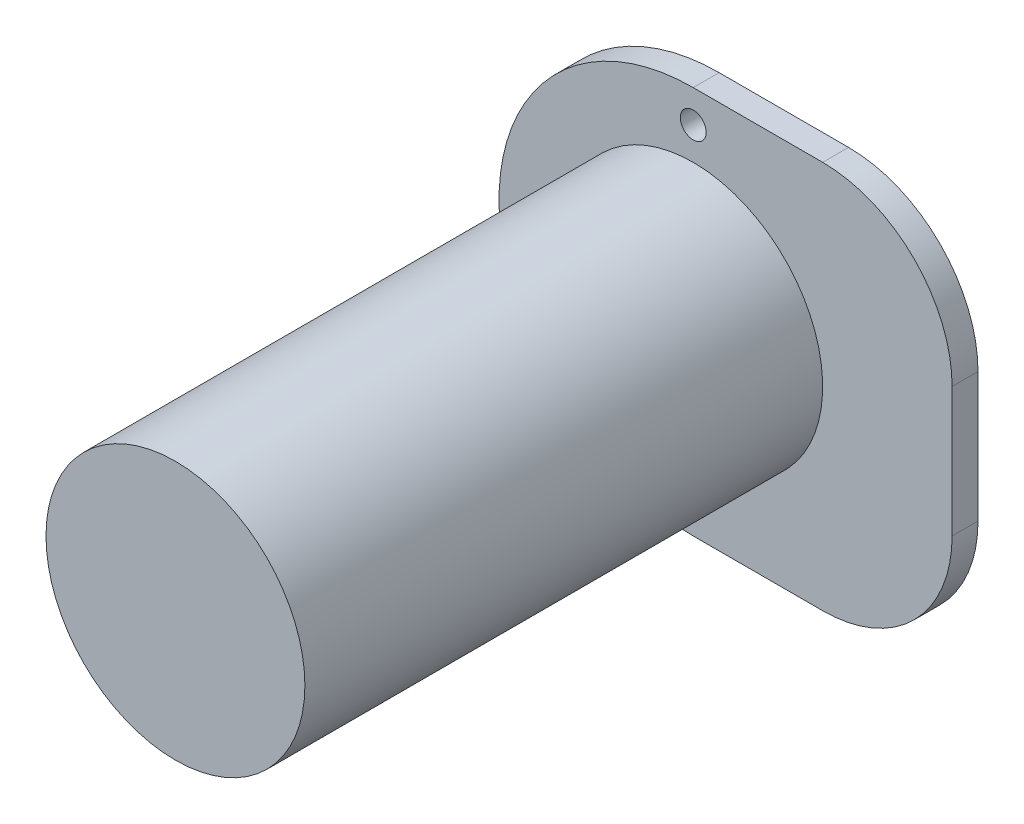
ISO-10303-21;
HEADER;
FILE_DESCRIPTION(('STEP AP214'),'2;1');
FILE_NAME('part.step','',(''),(''),'','','');
FILE_SCHEMA(('AUTOMOTIVE_DESIGN { 1 0 10303 214 1 1 1 1 }'));
ENDSEC;
DATA;
#1=APPLICATION_CONTEXT('core data for automotive mechanical design processes');
#2=APPLICATION_PROTOCOL_DEFINITION('international standard','automotive_design',2000,#1);
#3=PRODUCT_CONTEXT('',#1,'mechanical');
#4=PRODUCT('Part','Part','',(#3));
#5=PRODUCT_RELATED_PRODUCT_CATEGORY('part','',(#4));
#6=PRODUCT_DEFINITION_FORMATION('','',#4);
#7=PRODUCT_DEFINITION_CONTEXT('part definition',#1,'design');
#8=PRODUCT_DEFINITION('design','',#6,#7);
#9=PRODUCT_DEFINITION_SHAPE('','',#8);
#10=(LENGTH_UNIT() NAMED_UNIT(*) SI_UNIT(.MILLI.,.METRE.));
#11=(NAMED_UNIT(*) PLANE_ANGLE_UNIT() SI_UNIT($,.RADIAN.));
#12=(NAMED_UNIT(*) SI_UNIT($,.STERADIAN.) SOLID_ANGLE_UNIT());
#13=UNCERTAINTY_MEASURE_WITH_UNIT(LENGTH_MEASURE(1.E-05),#10,'distance_accuracy_value','');
#14=(GEOMETRIC_REPRESENTATION_CONTEXT(3) GLOBAL_UNCERTAINTY_ASSIGNED_CONTEXT((#13)) GLOBAL_UNIT_ASSIGNED_CONTEXT((#10,
#11,#12)) REPRESENTATION_CONTEXT('',''));
#15=CARTESIAN_POINT('',(0.,0.,0.));
#16=DIRECTION('',(0.,0.,1.));
#17=DIRECTION('',(1.,0.,0.));
#18=AXIS2_PLACEMENT_3D('',#15,#16,#17);
#19=CARTESIAN_POINT('',(0.,0.,105.));
#20=DIRECTION('',(0.,0.,-1.));
#21=DIRECTION('',(-1.,0.,0.));
#22=AXIS2_PLACEMENT_3D('',#19,#20,#21);
#23=CYLINDRICAL_SURFACE('',#22,50.);
#24=CARTESIAN_POINT('',(0.,0.,105.));
#25=DIRECTION('',(0.,0.,1.));
#26=DIRECTION('',(1.,0.,0.));
#27=AXIS2_PLACEMENT_3D('',#24,#25,#26);
#28=CIRCLE('',#27,50.);
#29=CARTESIAN_POINT('',(50.,0.,105.));
#30=VERTEX_POINT('',#29);
#31=EDGE_CURVE('E126',#30,#30,#28,.T.);
#32=ORIENTED_EDGE('',*,*,#31,.F.);
#33=EDGE_LOOP('',(#32));
#34=FACE_BOUND('',#33,.T.);
#35=CARTESIAN_POINT('',(0.,0.,-95.));
#36=DIRECTION('',(0.,0.,-1.));
#37=DIRECTION('',(-1.,0.,0.));
#38=AXIS2_PLACEMENT_3D('',#35,#36,#37);
#39=CIRCLE('',#38,50.);
#40=CARTESIAN_POINT('',(-50.,0.,-95.));
#41=VERTEX_POINT('',#40);
#42=EDGE_CURVE('E130',#41,#41,#39,.T.);
#43=ORIENTED_EDGE('',*,*,#42,.F.);
#44=EDGE_LOOP('',(#43));
#45=FACE_BOUND('',#44,.T.);
#46=ADVANCED_FACE('F36',(#34,#45),#23,.T.);
#47=CARTESIAN_POINT('',(0.,0.,105.));
#48=DIRECTION('',(0.,0.,1.));
#49=DIRECTION('',(1.,0.,0.));
#50=AXIS2_PLACEMENT_3D('',#47,#48,#49);
#51=PLANE('',#50);
#52=ORIENTED_EDGE('',*,*,#31,.T.);
#53=EDGE_LOOP('',(#52));
#54=FACE_BOUND('',#53,.T.);
#55=ADVANCED_FACE('F166',(#54),#51,.T.);
#56=CARTESIAN_POINT('',(0.,-75.,-95.));
#57=DIRECTION('',(0.,-1.,0.));
#58=DIRECTION('',(0.,0.,-1.));
#59=AXIS2_PLACEMENT_3D('',#56,#57,#58);
#60=PLANE('',#59);
#61=DIRECTION('',(-1.,0.,0.));
#62=VECTOR('',#61,1.);
#63=CARTESIAN_POINT('',(0.,-75.,-105.));
#64=LINE('',#63,#62);
#65=CARTESIAN_POINT('',(50.,-75.,-105.));
#66=VERTEX_POINT('',#65);
#67=CARTESIAN_POINT('',(0.,-75.,-105.));
#68=VERTEX_POINT('',#67);
#69=EDGE_CURVE('E117',#66,#68,#64,.T.);
#70=ORIENTED_EDGE('',*,*,#69,.F.);
#71=DIRECTION('',(0.,0.,-1.));
#72=VECTOR('',#71,1.);
#73=CARTESIAN_POINT('',(50.,-75.,-95.));
#74=LINE('',#73,#72);
#75=CARTESIAN_POINT('',(50.,-75.,-95.));
#76=VERTEX_POINT('',#75);
#77=EDGE_CURVE('E59',#66,#76,#74,.F.);
#78=ORIENTED_EDGE('',*,*,#77,.T.);
#79=DIRECTION('',(-1.,0.,0.));
#80=VECTOR('',#79,1.);
#81=CARTESIAN_POINT('',(0.,-75.,-95.));
#82=LINE('',#81,#80);
#83=CARTESIAN_POINT('',(0.,-75.,-95.));
#84=VERTEX_POINT('',#83);
#85=EDGE_CURVE('E90',#76,#84,#82,.T.);
#86=ORIENTED_EDGE('',*,*,#85,.T.);
#87=DIRECTION('',(0.,0.,-1.));
#88=VECTOR('',#87,1.);
#89=CARTESIAN_POINT('',(0.,-75.,-95.));
#90=LINE('',#89,#88);
#91=EDGE_CURVE('E93',#84,#68,#90,.T.);
#92=ORIENTED_EDGE('',*,*,#91,.T.);
#93=EDGE_LOOP('',(#70,#78,#86,#92));
#94=FACE_BOUND('',#93,.T.);
#95=ADVANCED_FACE('F92',(#94),#60,.T.);
#96=CARTESIAN_POINT('',(100.,0.,-95.));
#97=DIRECTION('',(1.,0.,0.));
#98=DIRECTION('',(0.,0.,-1.));
#99=AXIS2_PLACEMENT_3D('',#96,#97,#98);
#100=PLANE('',#99);
#101=DIRECTION('',(0.,-1.,0.));
#102=VECTOR('',#101,1.);
#103=CARTESIAN_POINT('',(100.,0.,-95.));
#104=LINE('',#103,#102);
#105=CARTESIAN_POINT('',(100.,25.,-95.));
#106=VERTEX_POINT('',#105);
#107=CARTESIAN_POINT('',(100.,-25.,-95.));
#108=VERTEX_POINT('',#107);
#109=EDGE_CURVE('E106',#106,#108,#104,.T.);
#110=ORIENTED_EDGE('',*,*,#109,.T.);
#111=DIRECTION('',(0.,0.,-1.));
#112=VECTOR('',#111,1.);
#113=CARTESIAN_POINT('',(100.,-25.,-95.));
#114=LINE('',#113,#112);
#115=CARTESIAN_POINT('',(100.,-25.,-105.));
#116=VERTEX_POINT('',#115);
#117=EDGE_CURVE('E135',#108,#116,#114,.T.);
#118=ORIENTED_EDGE('',*,*,#117,.T.);
#119=DIRECTION('',(0.,-1.,0.));
#120=VECTOR('',#119,1.);
#121=CARTESIAN_POINT('',(100.,0.,-105.));
#122=LINE('',#121,#120);
#123=CARTESIAN_POINT('',(100.,25.,-105.));
#124=VERTEX_POINT('',#123);
#125=EDGE_CURVE('E98',#124,#116,#122,.T.);
#126=ORIENTED_EDGE('',*,*,#125,.F.);
#127=DIRECTION('',(0.,0.,-1.));
#128=VECTOR('',#127,1.);
#129=CARTESIAN_POINT('',(100.,25.,-95.));
#130=LINE('',#129,#128);
#131=EDGE_CURVE('E133',#124,#106,#130,.F.);
#132=ORIENTED_EDGE('',*,*,#131,.T.);
#133=EDGE_LOOP('',(#110,#118,#126,#132));
#134=FACE_BOUND('',#133,.T.);
#135=ADVANCED_FACE('F146',(#134),#100,.T.);
#136=CARTESIAN_POINT('',(0.,75.,-95.));
#137=DIRECTION('',(0.,1.,0.));
#138=DIRECTION('',(-1.,0.,0.));
#139=AXIS2_PLACEMENT_3D('',#136,#137,#138);
#140=PLANE('',#139);
#141=DIRECTION('',(1.,0.,0.));
#142=VECTOR('',#141,1.);
#143=CARTESIAN_POINT('',(0.,75.,-95.));
#144=LINE('',#143,#142);
#145=CARTESIAN_POINT('',(0.,75.,-95.));
#146=VERTEX_POINT('',#145);
#147=CARTESIAN_POINT('',(50.,75.,-95.));
#148=VERTEX_POINT('',#147);
#149=EDGE_CURVE('E110',#146,#148,#144,.T.);
#150=ORIENTED_EDGE('',*,*,#149,.T.);
#151=DIRECTION('',(0.,0.,-1.));
#152=VECTOR('',#151,1.);
#153=CARTESIAN_POINT('',(50.,75.,-95.));
#154=LINE('',#153,#152);
#155=CARTESIAN_POINT('',(50.,75.,-105.));
#156=VERTEX_POINT('',#155);
#157=EDGE_CURVE('E11',#148,#156,#154,.T.);
#158=ORIENTED_EDGE('',*,*,#157,.T.);
#159=DIRECTION('',(1.,0.,0.));
#160=VECTOR('',#159,1.);
#161=CARTESIAN_POINT('',(0.,75.,-105.));
#162=LINE('',#161,#160);
#163=CARTESIAN_POINT('',(0.,75.,-105.));
#164=VERTEX_POINT('',#163);
#165=EDGE_CURVE('E121',#164,#156,#162,.T.);
#166=ORIENTED_EDGE('',*,*,#165,.F.);
#167=DIRECTION('',(0.,0.,-1.));
#168=VECTOR('',#167,1.);
#169=CARTESIAN_POINT('',(0.,75.,-95.));
#170=LINE('',#169,#168);
#171=EDGE_CURVE('E105',#146,#164,#170,.T.);
#172=ORIENTED_EDGE('',*,*,#171,.F.);
#173=EDGE_LOOP('',(#150,#158,#166,#172));
#174=FACE_BOUND('',#173,.T.);
#175=ADVANCED_FACE('F156',(#174),#140,.T.);
#176=CARTESIAN_POINT('',(0.,0.,-95.));
#177=DIRECTION('',(0.,0.,-1.));
#178=DIRECTION('',(-1.,0.,0.));
#179=AXIS2_PLACEMENT_3D('',#176,#177,#178);
#180=CYLINDRICAL_SURFACE('',#179,75.);
#181=CARTESIAN_POINT('',(0.,0.,-105.));
#182=DIRECTION('',(0.,0.,-1.));
#183=DIRECTION('',(-1.,0.,0.));
#184=AXIS2_PLACEMENT_3D('',#181,#182,#183);
#185=CIRCLE('',#184,75.);
#186=EDGE_CURVE('E104',#68,#164,#185,.T.);
#187=ORIENTED_EDGE('',*,*,#186,.F.);
#188=ORIENTED_EDGE('',*,*,#91,.F.);
#189=CARTESIAN_POINT('',(0.,0.,-95.));
#190=DIRECTION('',(0.,0.,-1.));
#191=DIRECTION('',(-1.,0.,0.));
#192=AXIS2_PLACEMENT_3D('',#189,#190,#191);
#193=CIRCLE('',#192,75.);
#194=EDGE_CURVE('E97',#84,#146,#193,.T.);
#195=ORIENTED_EDGE('',*,*,#194,.T.);
#196=ORIENTED_EDGE('',*,*,#171,.T.);
#197=EDGE_LOOP('',(#187,#188,#195,#196));
#198=FACE_BOUND('',#197,.T.);
#199=ADVANCED_FACE('F102',(#198),#180,.T.);
#200=CARTESIAN_POINT('',(0.,0.,-95.));
#201=DIRECTION('',(0.,0.,-1.));
#202=DIRECTION('',(-1.,0.,0.));
#203=AXIS2_PLACEMENT_3D('',#200,#201,#202);
#204=PLANE('',#203);
#205=CARTESIAN_POINT('',(-62.5000000000035,-2.29698647419702E-13,-95.));
#206=DIRECTION('',(0.,0.,-1.));
#207=DIRECTION('',(-1.,0.,0.));
#208=AXIS2_PLACEMENT_3D('',#205,#206,#207);
#209=CIRCLE('',#208,4.99999999999895);
#210=CARTESIAN_POINT('',(-67.5000000000025,-2.29698647419702E-13,-95.));
#211=VERTEX_POINT('',#210);
#212=EDGE_CURVE('E206',#211,#211,#209,.T.);
#213=ORIENTED_EDGE('',*,*,#212,.T.);
#214=EDGE_LOOP('',(#213));
#215=FACE_BOUND('',#214,.T.);
#216=CARTESIAN_POINT('',(4.36435167355392E-13,-62.5,-95.));
#217=DIRECTION('',(0.,0.,-1.));
#218=DIRECTION('',(-1.,0.,0.));
#219=AXIS2_PLACEMENT_3D('',#216,#217,#218);
#220=CIRCLE('',#219,5.);
#221=CARTESIAN_POINT('',(-4.99999999999957,-62.5,-95.));
#222=VERTEX_POINT('',#221);
#223=EDGE_CURVE('E210',#222,#222,#220,.T.);
#224=ORIENTED_EDGE('',*,*,#223,.T.);
#225=EDGE_LOOP('',(#224));
#226=FACE_BOUND('',#225,.T.);
#227=CARTESIAN_POINT('',(0.,62.5,-95.));
#228=DIRECTION('',(0.,0.,-1.));
#229=DIRECTION('',(-1.,0.,0.));
#230=AXIS2_PLACEMENT_3D('',#227,#228,#229);
#231=CIRCLE('',#230,5.);
#232=CARTESIAN_POINT('',(-5.,62.5,-95.));
#233=VERTEX_POINT('',#232);
#234=EDGE_CURVE('E119',#233,#233,#231,.T.);
#235=ORIENTED_EDGE('',*,*,#234,.T.);
#236=EDGE_LOOP('',(#235));
#237=FACE_BOUND('',#236,.T.);
#238=ORIENTED_EDGE('',*,*,#85,.F.);
#239=CARTESIAN_POINT('',(50.,-25.,-95.));
#240=DIRECTION('',(0.,0.,-1.));
#241=DIRECTION('',(-1.,0.,0.));
#242=AXIS2_PLACEMENT_3D('',#239,#240,#241);
#243=CIRCLE('',#242,50.);
#244=EDGE_CURVE('E44',#76,#108,#243,.F.);
#245=ORIENTED_EDGE('',*,*,#244,.T.);
#246=ORIENTED_EDGE('',*,*,#109,.F.);
#247=CARTESIAN_POINT('',(50.,25.,-95.));
#248=DIRECTION('',(0.,0.,-1.));
#249=DIRECTION('',(-1.,0.,0.));
#250=AXIS2_PLACEMENT_3D('',#247,#248,#249);
#251=CIRCLE('',#250,50.);
#252=EDGE_CURVE('E51',#106,#148,#251,.F.);
#253=ORIENTED_EDGE('',*,*,#252,.T.);
#254=ORIENTED_EDGE('',*,*,#149,.F.);
#255=ORIENTED_EDGE('',*,*,#194,.F.);
#256=EDGE_LOOP('',(#238,#245,#246,#253,#254,#255));
#257=FACE_BOUND('',#256,.T.);
#258=ORIENTED_EDGE('',*,*,#42,.T.);
#259=EDGE_LOOP('',(#258));
#260=FACE_BOUND('',#259,.T.);
#261=ADVANCED_FACE('F108',(#215,#226,#237,#257,#260),#204,.F.);
#262=CARTESIAN_POINT('',(0.,0.,-105.));
#263=DIRECTION('',(0.,0.,1.));
#264=DIRECTION('',(1.,0.,0.));
#265=AXIS2_PLACEMENT_3D('',#262,#263,#264);
#266=PLANE('',#265);
#267=CARTESIAN_POINT('',(-62.5000000000035,-2.29698647419702E-13,-105.));
#268=DIRECTION('',(0.,0.,-1.));
#269=DIRECTION('',(-1.,0.,0.));
#270=AXIS2_PLACEMENT_3D('',#267,#268,#269);
#271=CIRCLE('',#270,4.99999999999895);
#272=CARTESIAN_POINT('',(-67.5000000000025,-2.29698647419702E-13,-105.));
#273=VERTEX_POINT('',#272);
#274=EDGE_CURVE('E216',#273,#273,#271,.T.);
#275=ORIENTED_EDGE('',*,*,#274,.F.);
#276=EDGE_LOOP('',(#275));
#277=FACE_BOUND('',#276,.T.);
#278=CARTESIAN_POINT('',(4.36435167355392E-13,-62.5,-105.));
#279=DIRECTION('',(0.,0.,-1.));
#280=DIRECTION('',(-1.,0.,0.));
#281=AXIS2_PLACEMENT_3D('',#278,#279,#280);
#282=CIRCLE('',#281,5.);
#283=CARTESIAN_POINT('',(-4.99999999999957,-62.5,-105.));
#284=VERTEX_POINT('',#283);
#285=EDGE_CURVE('E219',#284,#284,#282,.T.);
#286=ORIENTED_EDGE('',*,*,#285,.F.);
#287=EDGE_LOOP('',(#286));
#288=FACE_BOUND('',#287,.T.);
#289=CARTESIAN_POINT('',(0.,62.5,-105.));
#290=DIRECTION('',(0.,0.,-1.));
#291=DIRECTION('',(-1.,0.,0.));
#292=AXIS2_PLACEMENT_3D('',#289,#290,#291);
#293=CIRCLE('',#292,5.);
#294=CARTESIAN_POINT('',(-5.,62.5,-105.));
#295=VERTEX_POINT('',#294);
#296=EDGE_CURVE('E213',#295,#295,#293,.T.);
#297=ORIENTED_EDGE('',*,*,#296,.F.);
#298=EDGE_LOOP('',(#297));
#299=FACE_BOUND('',#298,.T.);
#300=ORIENTED_EDGE('',*,*,#125,.T.);
#301=CARTESIAN_POINT('',(50.,-25.,-105.));
#302=DIRECTION('',(0.,0.,1.));
#303=DIRECTION('',(1.,0.,0.));
#304=AXIS2_PLACEMENT_3D('',#301,#302,#303);
#305=CIRCLE('',#304,50.);
#306=EDGE_CURVE('E140',#116,#66,#305,.F.);
#307=ORIENTED_EDGE('',*,*,#306,.T.);
#308=ORIENTED_EDGE('',*,*,#69,.T.);
#309=ORIENTED_EDGE('',*,*,#186,.T.);
#310=ORIENTED_EDGE('',*,*,#165,.T.);
#311=CARTESIAN_POINT('',(50.,25.,-105.));
#312=DIRECTION('',(0.,0.,1.));
#313=DIRECTION('',(1.,0.,0.));
#314=AXIS2_PLACEMENT_3D('',#311,#312,#313);
#315=CIRCLE('',#314,50.);
#316=EDGE_CURVE('E138',#156,#124,#315,.F.);
#317=ORIENTED_EDGE('',*,*,#316,.T.);
#318=EDGE_LOOP('',(#300,#307,#308,#309,#310,#317));
#319=FACE_BOUND('',#318,.T.);
#320=ADVANCED_FACE('F151',(#277,#288,#299,#319),#266,.F.);
#321=CARTESIAN_POINT('',(0.,62.5,-95.));
#322=DIRECTION('',(0.,0.,-1.));
#323=DIRECTION('',(-1.,0.,0.));
#324=AXIS2_PLACEMENT_3D('',#321,#322,#323);
#325=CYLINDRICAL_SURFACE('',#324,5.);
#326=ORIENTED_EDGE('',*,*,#234,.F.);
#327=EDGE_LOOP('',(#326));
#328=FACE_BOUND('',#327,.T.);
#329=ORIENTED_EDGE('',*,*,#296,.T.);
#330=EDGE_LOOP('',(#329));
#331=FACE_BOUND('',#330,.T.);
#332=ADVANCED_FACE('F189',(#328,#331),#325,.F.);
#333=CARTESIAN_POINT('',(4.36435167355392E-13,-62.5,-95.));
#334=DIRECTION('',(0.,0.,-1.));
#335=DIRECTION('',(-1.,0.,0.));
#336=AXIS2_PLACEMENT_3D('',#333,#334,#335);
#337=CYLINDRICAL_SURFACE('',#336,5.);
#338=ORIENTED_EDGE('',*,*,#223,.F.);
#339=EDGE_LOOP('',(#338));
#340=FACE_BOUND('',#339,.T.);
#341=ORIENTED_EDGE('',*,*,#285,.T.);
#342=EDGE_LOOP('',(#341));
#343=FACE_BOUND('',#342,.T.);
#344=ADVANCED_FACE('F183',(#340,#343),#337,.F.);
#345=CARTESIAN_POINT('',(-62.5000000000035,-2.29698647419702E-13,-95.));
#346=DIRECTION('',(0.,0.,-1.));
#347=DIRECTION('',(-1.,0.,0.));
#348=AXIS2_PLACEMENT_3D('',#345,#346,#347);
#349=CYLINDRICAL_SURFACE('',#348,4.99999999999895);
#350=ORIENTED_EDGE('',*,*,#212,.F.);
#351=EDGE_LOOP('',(#350));
#352=FACE_BOUND('',#351,.T.);
#353=ORIENTED_EDGE('',*,*,#274,.T.);
#354=EDGE_LOOP('',(#353));
#355=FACE_BOUND('',#354,.T.);
#356=ADVANCED_FACE('F178',(#352,#355),#349,.F.);
#357=CARTESIAN_POINT('',(50.,-25.,-95.));
#358=DIRECTION('',(0.,0.,-1.));
#359=DIRECTION('',(-1.,0.,0.));
#360=AXIS2_PLACEMENT_3D('',#357,#358,#359);
#361=CYLINDRICAL_SURFACE('',#360,50.);
#362=ORIENTED_EDGE('',*,*,#244,.F.);
#363=ORIENTED_EDGE('',*,*,#77,.F.);
#364=ORIENTED_EDGE('',*,*,#306,.F.);
#365=ORIENTED_EDGE('',*,*,#117,.F.);
#366=EDGE_LOOP('',(#362,#363,#364,#365));
#367=FACE_BOUND('',#366,.T.);
#368=ADVANCED_FACE('F149',(#367),#361,.T.);
#369=CARTESIAN_POINT('',(50.,25.,-95.));
#370=DIRECTION('',(0.,0.,-1.));
#371=DIRECTION('',(-1.,0.,0.));
#372=AXIS2_PLACEMENT_3D('',#369,#370,#371);
#373=CYLINDRICAL_SURFACE('',#372,50.);
#374=ORIENTED_EDGE('',*,*,#252,.F.);
#375=ORIENTED_EDGE('',*,*,#131,.F.);
#376=ORIENTED_EDGE('',*,*,#316,.F.);
#377=ORIENTED_EDGE('',*,*,#157,.F.);
#378=EDGE_LOOP('',(#374,#375,#376,#377));
#379=FACE_BOUND('',#378,.T.);
#380=ADVANCED_FACE('F38',(#379),#373,.T.);
#381=CLOSED_SHELL('',(#46,#55,#95,#135,#175,#199,#261,#320,#332,#344,#356,#368,#380));
#382=MANIFOLD_SOLID_BREP('B2',#381);
#383=ADVANCED_BREP_SHAPE_REPRESENTATION('',(#18,#382),#14);
#384=SHAPE_DEFINITION_REPRESENTATION(#9,#383);
ENDSEC;
END-ISO-10303-21;
